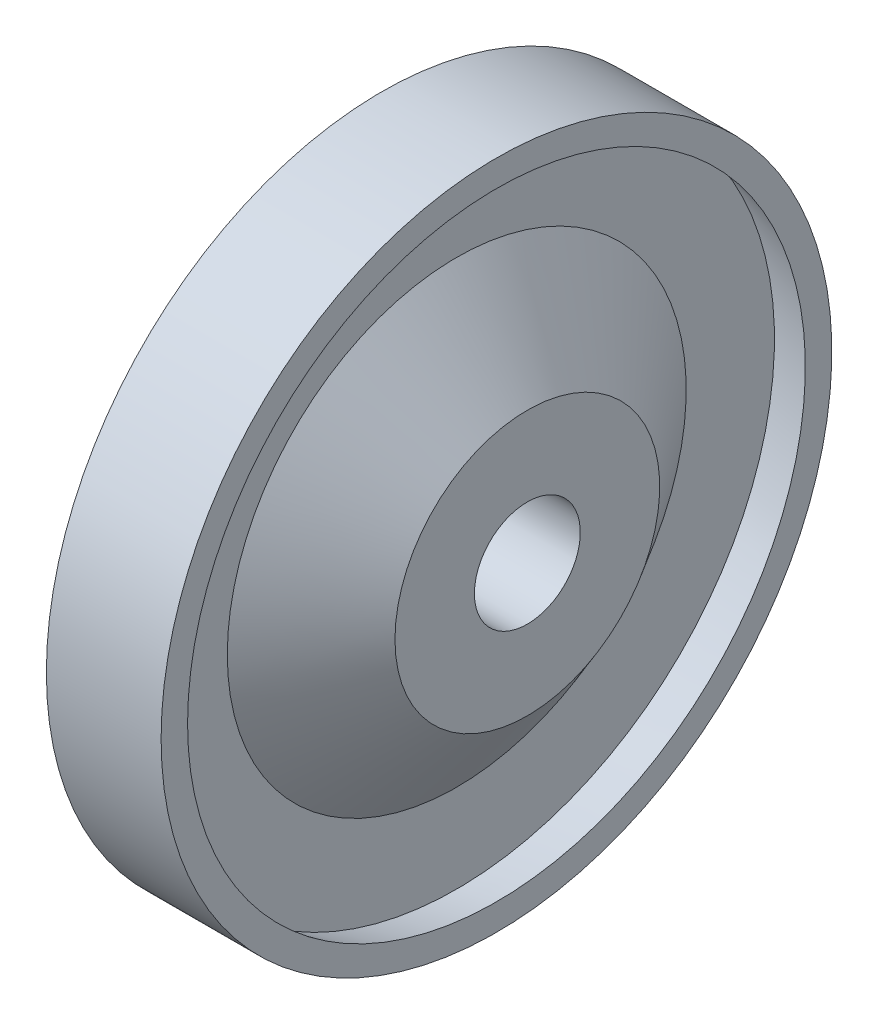
ISO-10303-21;
HEADER;
FILE_DESCRIPTION(('STEP AP214'),'2;1');
FILE_NAME('part.step','',(''),(''),'','','');
FILE_SCHEMA(('AUTOMOTIVE_DESIGN { 1 0 10303 214 1 1 1 1 }'));
ENDSEC;
DATA;
#1=APPLICATION_CONTEXT('core data for automotive mechanical design processes');
#2=APPLICATION_PROTOCOL_DEFINITION('international standard','automotive_design',2000,#1);
#3=PRODUCT_CONTEXT('',#1,'mechanical');
#4=PRODUCT('Part','Part','',(#3));
#5=PRODUCT_RELATED_PRODUCT_CATEGORY('part','',(#4));
#6=PRODUCT_DEFINITION_FORMATION('','',#4);
#7=PRODUCT_DEFINITION_CONTEXT('part definition',#1,'design');
#8=PRODUCT_DEFINITION('design','',#6,#7);
#9=PRODUCT_DEFINITION_SHAPE('','',#8);
#10=(LENGTH_UNIT() NAMED_UNIT(*) SI_UNIT(.MILLI.,.METRE.));
#11=(NAMED_UNIT(*) PLANE_ANGLE_UNIT() SI_UNIT($,.RADIAN.));
#12=(NAMED_UNIT(*) SI_UNIT($,.STERADIAN.) SOLID_ANGLE_UNIT());
#13=UNCERTAINTY_MEASURE_WITH_UNIT(LENGTH_MEASURE(1.E-05),#10,'distance_accuracy_value','');
#14=(GEOMETRIC_REPRESENTATION_CONTEXT(3) GLOBAL_UNCERTAINTY_ASSIGNED_CONTEXT((#13)) GLOBAL_UNIT_ASSIGNED_CONTEXT((#10,
#11,#12)) REPRESENTATION_CONTEXT('',''));
#15=CARTESIAN_POINT('',(0.,0.,0.));
#16=DIRECTION('',(0.,0.,1.));
#17=DIRECTION('',(1.,0.,0.));
#18=AXIS2_PLACEMENT_3D('',#15,#16,#17);
#19=CARTESIAN_POINT('',(0.,0.,0.));
#20=DIRECTION('',(-1.,0.,0.));
#21=DIRECTION('',(0.,0.,1.));
#22=AXIS2_PLACEMENT_3D('',#19,#20,#21);
#23=CYLINDRICAL_SURFACE('',#22,76.);
#24=CARTESIAN_POINT('',(-13.,0.,0.));
#25=DIRECTION('',(-1.,0.,0.));
#26=DIRECTION('',(0.,0.,1.));
#27=AXIS2_PLACEMENT_3D('',#24,#25,#26);
#28=CIRCLE('',#27,76.);
#29=CARTESIAN_POINT('',(-13.,0.,76.));
#30=VERTEX_POINT('',#29);
#31=EDGE_CURVE('E77',#30,#30,#28,.T.);
#32=ORIENTED_EDGE('',*,*,#31,.F.);
#33=EDGE_LOOP('',(#32));
#34=FACE_BOUND('',#33,.T.);
#35=CARTESIAN_POINT('',(13.,0.,0.));
#36=DIRECTION('',(-1.,0.,0.));
#37=DIRECTION('',(0.,0.,1.));
#38=AXIS2_PLACEMENT_3D('',#35,#36,#37);
#39=CIRCLE('',#38,76.);
#40=CARTESIAN_POINT('',(13.,0.,76.));
#41=VERTEX_POINT('',#40);
#42=EDGE_CURVE('E10',#41,#41,#39,.T.);
#43=ORIENTED_EDGE('',*,*,#42,.T.);
#44=EDGE_LOOP('',(#43));
#45=FACE_BOUND('',#44,.T.);
#46=ADVANCED_FACE('F37',(#34,#45),#23,.T.);
#47=CARTESIAN_POINT('',(13.,76.,0.));
#48=DIRECTION('',(-1.,0.,0.));
#49=DIRECTION('',(0.,0.,1.));
#50=AXIS2_PLACEMENT_3D('',#47,#48,#49);
#51=PLANE('',#50);
#52=ORIENTED_EDGE('',*,*,#42,.F.);
#53=EDGE_LOOP('',(#52));
#54=FACE_BOUND('',#53,.T.);
#55=CARTESIAN_POINT('',(13.,0.,0.));
#56=DIRECTION('',(-1.,0.,0.));
#57=DIRECTION('',(0.,0.,1.));
#58=AXIS2_PLACEMENT_3D('',#55,#56,#57);
#59=CIRCLE('',#58,70.);
#60=CARTESIAN_POINT('',(13.,0.,70.));
#61=VERTEX_POINT('',#60);
#62=EDGE_CURVE('E43',#61,#61,#59,.T.);
#63=ORIENTED_EDGE('',*,*,#62,.T.);
#64=EDGE_LOOP('',(#63));
#65=FACE_BOUND('',#64,.T.);
#66=ADVANCED_FACE('F84',(#54,#65),#51,.F.);
#67=CARTESIAN_POINT('',(4.,0.,0.));
#68=DIRECTION('',(-1.,0.,0.));
#69=DIRECTION('',(0.,0.,1.));
#70=AXIS2_PLACEMENT_3D('',#67,#68,#69);
#71=CONICAL_SURFACE('',#70,72.,0.218668945873941);
#72=ORIENTED_EDGE('',*,*,#62,.F.);
#73=EDGE_LOOP('',(#72));
#74=FACE_BOUND('',#73,.T.);
#75=CARTESIAN_POINT('',(4.,0.,0.));
#76=DIRECTION('',(-1.,0.,0.));
#77=DIRECTION('',(0.,0.,1.));
#78=AXIS2_PLACEMENT_3D('',#75,#76,#77);
#79=CIRCLE('',#78,72.);
#80=CARTESIAN_POINT('',(4.,0.,72.));
#81=VERTEX_POINT('',#80);
#82=EDGE_CURVE('E47',#81,#81,#79,.T.);
#83=ORIENTED_EDGE('',*,*,#82,.T.);
#84=EDGE_LOOP('',(#83));
#85=FACE_BOUND('',#84,.T.);
#86=ADVANCED_FACE('F88',(#74,#85),#71,.F.);
#87=CARTESIAN_POINT('',(4.,72.,0.));
#88=DIRECTION('',(-1.,0.,0.));
#89=DIRECTION('',(0.,0.,1.));
#90=AXIS2_PLACEMENT_3D('',#87,#88,#89);
#91=PLANE('',#90);
#92=ORIENTED_EDGE('',*,*,#82,.F.);
#93=EDGE_LOOP('',(#92));
#94=FACE_BOUND('',#93,.T.);
#95=CARTESIAN_POINT('',(4.,0.,0.));
#96=DIRECTION('',(-1.,0.,0.));
#97=DIRECTION('',(0.,0.,1.));
#98=AXIS2_PLACEMENT_3D('',#95,#96,#97);
#99=CIRCLE('',#98,52.);
#100=CARTESIAN_POINT('',(4.,0.,52.));
#101=VERTEX_POINT('',#100);
#102=EDGE_CURVE('E51',#101,#101,#99,.T.);
#103=ORIENTED_EDGE('',*,*,#102,.T.);
#104=EDGE_LOOP('',(#103));
#105=FACE_BOUND('',#104,.T.);
#106=ADVANCED_FACE('F93',(#94,#105),#91,.F.);
#107=CARTESIAN_POINT('',(20.,0.,0.));
#108=DIRECTION('',(-1.,0.,0.));
#109=DIRECTION('',(0.,0.,1.));
#110=AXIS2_PLACEMENT_3D('',#107,#108,#109);
#111=CONICAL_SURFACE('',#110,30.,0.942000040379464);
#112=ORIENTED_EDGE('',*,*,#102,.F.);
#113=EDGE_LOOP('',(#112));
#114=FACE_BOUND('',#113,.T.);
#115=CARTESIAN_POINT('',(20.,0.,0.));
#116=DIRECTION('',(-1.,0.,0.));
#117=DIRECTION('',(0.,0.,1.));
#118=AXIS2_PLACEMENT_3D('',#115,#116,#117);
#119=CIRCLE('',#118,30.);
#120=CARTESIAN_POINT('',(20.,0.,30.));
#121=VERTEX_POINT('',#120);
#122=EDGE_CURVE('E56',#121,#121,#119,.T.);
#123=ORIENTED_EDGE('',*,*,#122,.T.);
#124=EDGE_LOOP('',(#123));
#125=FACE_BOUND('',#124,.T.);
#126=ADVANCED_FACE('F99',(#114,#125),#111,.T.);
#127=CARTESIAN_POINT('',(20.,30.,0.));
#128=DIRECTION('',(-1.,0.,0.));
#129=DIRECTION('',(0.,0.,1.));
#130=AXIS2_PLACEMENT_3D('',#127,#128,#129);
#131=PLANE('',#130);
#132=ORIENTED_EDGE('',*,*,#122,.F.);
#133=EDGE_LOOP('',(#132));
#134=FACE_BOUND('',#133,.T.);
#135=CARTESIAN_POINT('',(20.,0.,0.));
#136=DIRECTION('',(-1.,0.,0.));
#137=DIRECTION('',(0.,0.,1.));
#138=AXIS2_PLACEMENT_3D('',#135,#136,#137);
#139=CIRCLE('',#138,12.);
#140=CARTESIAN_POINT('',(20.,0.,12.));
#141=VERTEX_POINT('',#140);
#142=EDGE_CURVE('E59',#141,#141,#139,.T.);
#143=ORIENTED_EDGE('',*,*,#142,.T.);
#144=EDGE_LOOP('',(#143));
#145=FACE_BOUND('',#144,.T.);
#146=ADVANCED_FACE('F103',(#134,#145),#131,.F.);
#147=CARTESIAN_POINT('',(0.,0.,0.));
#148=DIRECTION('',(-1.,0.,0.));
#149=DIRECTION('',(0.,0.,1.));
#150=AXIS2_PLACEMENT_3D('',#147,#148,#149);
#151=CYLINDRICAL_SURFACE('',#150,12.);
#152=ORIENTED_EDGE('',*,*,#142,.F.);
#153=EDGE_LOOP('',(#152));
#154=FACE_BOUND('',#153,.T.);
#155=CARTESIAN_POINT('',(-20.,0.,0.));
#156=DIRECTION('',(-1.,0.,0.));
#157=DIRECTION('',(0.,0.,1.));
#158=AXIS2_PLACEMENT_3D('',#155,#156,#157);
#159=CIRCLE('',#158,12.);
#160=CARTESIAN_POINT('',(-20.,0.,12.));
#161=VERTEX_POINT('',#160);
#162=EDGE_CURVE('E62',#161,#161,#159,.T.);
#163=ORIENTED_EDGE('',*,*,#162,.T.);
#164=EDGE_LOOP('',(#163));
#165=FACE_BOUND('',#164,.T.);
#166=ADVANCED_FACE('F107',(#154,#165),#151,.F.);
#167=CARTESIAN_POINT('',(-20.,30.,0.));
#168=DIRECTION('',(1.,0.,0.));
#169=DIRECTION('',(0.,0.,-1.));
#170=AXIS2_PLACEMENT_3D('',#167,#168,#169);
#171=PLANE('',#170);
#172=ORIENTED_EDGE('',*,*,#162,.F.);
#173=EDGE_LOOP('',(#172));
#174=FACE_BOUND('',#173,.T.);
#175=CARTESIAN_POINT('',(-20.,0.,0.));
#176=DIRECTION('',(-1.,0.,0.));
#177=DIRECTION('',(0.,0.,1.));
#178=AXIS2_PLACEMENT_3D('',#175,#176,#177);
#179=CIRCLE('',#178,30.);
#180=CARTESIAN_POINT('',(-20.,0.,30.));
#181=VERTEX_POINT('',#180);
#182=EDGE_CURVE('E65',#181,#181,#179,.T.);
#183=ORIENTED_EDGE('',*,*,#182,.T.);
#184=EDGE_LOOP('',(#183));
#185=FACE_BOUND('',#184,.T.);
#186=ADVANCED_FACE('F111',(#174,#185),#171,.F.);
#187=CARTESIAN_POINT('',(-4.,0.,0.));
#188=DIRECTION('',(1.,0.,0.));
#189=DIRECTION('',(0.,0.,-1.));
#190=AXIS2_PLACEMENT_3D('',#187,#188,#189);
#191=CONICAL_SURFACE('',#190,52.,0.942000040379464);
#192=ORIENTED_EDGE('',*,*,#182,.F.);
#193=EDGE_LOOP('',(#192));
#194=FACE_BOUND('',#193,.T.);
#195=CARTESIAN_POINT('',(-4.,0.,0.));
#196=DIRECTION('',(-1.,0.,0.));
#197=DIRECTION('',(0.,0.,1.));
#198=AXIS2_PLACEMENT_3D('',#195,#196,#197);
#199=CIRCLE('',#198,52.);
#200=CARTESIAN_POINT('',(-4.,0.,52.));
#201=VERTEX_POINT('',#200);
#202=EDGE_CURVE('E68',#201,#201,#199,.T.);
#203=ORIENTED_EDGE('',*,*,#202,.T.);
#204=EDGE_LOOP('',(#203));
#205=FACE_BOUND('',#204,.T.);
#206=ADVANCED_FACE('F115',(#194,#205),#191,.T.);
#207=CARTESIAN_POINT('',(-4.,72.,0.));
#208=DIRECTION('',(1.,0.,0.));
#209=DIRECTION('',(0.,0.,-1.));
#210=AXIS2_PLACEMENT_3D('',#207,#208,#209);
#211=PLANE('',#210);
#212=ORIENTED_EDGE('',*,*,#202,.F.);
#213=EDGE_LOOP('',(#212));
#214=FACE_BOUND('',#213,.T.);
#215=CARTESIAN_POINT('',(-4.,0.,0.));
#216=DIRECTION('',(-1.,0.,0.));
#217=DIRECTION('',(0.,0.,1.));
#218=AXIS2_PLACEMENT_3D('',#215,#216,#217);
#219=CIRCLE('',#218,72.);
#220=CARTESIAN_POINT('',(-4.,0.,72.));
#221=VERTEX_POINT('',#220);
#222=EDGE_CURVE('E71',#221,#221,#219,.T.);
#223=ORIENTED_EDGE('',*,*,#222,.T.);
#224=EDGE_LOOP('',(#223));
#225=FACE_BOUND('',#224,.T.);
#226=ADVANCED_FACE('F119',(#214,#225),#211,.F.);
#227=CARTESIAN_POINT('',(-13.,0.,0.));
#228=DIRECTION('',(1.,0.,0.));
#229=DIRECTION('',(0.,0.,-1.));
#230=AXIS2_PLACEMENT_3D('',#227,#228,#229);
#231=CONICAL_SURFACE('',#230,70.,0.218668945873941);
#232=ORIENTED_EDGE('',*,*,#222,.F.);
#233=EDGE_LOOP('',(#232));
#234=FACE_BOUND('',#233,.T.);
#235=CARTESIAN_POINT('',(-13.,0.,0.));
#236=DIRECTION('',(-1.,0.,0.));
#237=DIRECTION('',(0.,0.,1.));
#238=AXIS2_PLACEMENT_3D('',#235,#236,#237);
#239=CIRCLE('',#238,70.);
#240=CARTESIAN_POINT('',(-13.,0.,70.));
#241=VERTEX_POINT('',#240);
#242=EDGE_CURVE('E74',#241,#241,#239,.T.);
#243=ORIENTED_EDGE('',*,*,#242,.T.);
#244=EDGE_LOOP('',(#243));
#245=FACE_BOUND('',#244,.T.);
#246=ADVANCED_FACE('F123',(#234,#245),#231,.F.);
#247=CARTESIAN_POINT('',(-13.,76.,0.));
#248=DIRECTION('',(1.,0.,0.));
#249=DIRECTION('',(0.,0.,-1.));
#250=AXIS2_PLACEMENT_3D('',#247,#248,#249);
#251=PLANE('',#250);
#252=ORIENTED_EDGE('',*,*,#242,.F.);
#253=EDGE_LOOP('',(#252));
#254=FACE_BOUND('',#253,.T.);
#255=ORIENTED_EDGE('',*,*,#31,.T.);
#256=EDGE_LOOP('',(#255));
#257=FACE_BOUND('',#256,.T.);
#258=ADVANCED_FACE('F81',(#254,#257),#251,.F.);
#259=CLOSED_SHELL('',(#46,#66,#86,#106,#126,#146,#166,#186,#206,#226,#246,#258));
#260=MANIFOLD_SOLID_BREP('B2',#259);
#261=ADVANCED_BREP_SHAPE_REPRESENTATION('',(#18,#260),#14);
#262=SHAPE_DEFINITION_REPRESENTATION(#9,#261);
ENDSEC;
END-ISO-10303-21;
